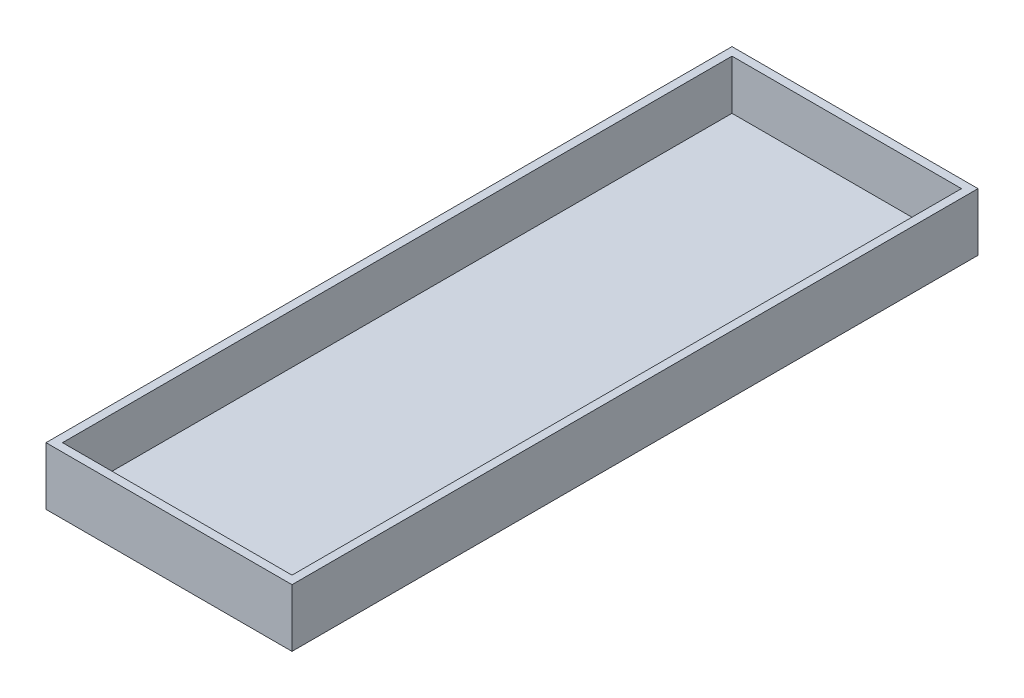
ISO-10303-21;
HEADER;
FILE_DESCRIPTION(('STEP AP214'),'2;1');
FILE_NAME('part.step','',(''),(''),'','','');
FILE_SCHEMA(('AUTOMOTIVE_DESIGN { 1 0 10303 214 1 1 1 1 }'));
ENDSEC;
DATA;
#1=APPLICATION_CONTEXT('core data for automotive mechanical design processes');
#2=APPLICATION_PROTOCOL_DEFINITION('international standard','automotive_design',2000,#1);
#3=PRODUCT_CONTEXT('',#1,'mechanical');
#4=PRODUCT('Part','Part','',(#3));
#5=PRODUCT_RELATED_PRODUCT_CATEGORY('part','',(#4));
#6=PRODUCT_DEFINITION_FORMATION('','',#4);
#7=PRODUCT_DEFINITION_CONTEXT('part definition',#1,'design');
#8=PRODUCT_DEFINITION('design','',#6,#7);
#9=PRODUCT_DEFINITION_SHAPE('','',#8);
#10=(LENGTH_UNIT() NAMED_UNIT(*) SI_UNIT(.MILLI.,.METRE.));
#11=(NAMED_UNIT(*) PLANE_ANGLE_UNIT() SI_UNIT($,.RADIAN.));
#12=(NAMED_UNIT(*) SI_UNIT($,.STERADIAN.) SOLID_ANGLE_UNIT());
#13=UNCERTAINTY_MEASURE_WITH_UNIT(LENGTH_MEASURE(1.E-05),#10,'distance_accuracy_value','');
#14=(GEOMETRIC_REPRESENTATION_CONTEXT(3) GLOBAL_UNCERTAINTY_ASSIGNED_CONTEXT((#13)) GLOBAL_UNIT_ASSIGNED_CONTEXT((#10,
#11,#12)) REPRESENTATION_CONTEXT('',''));
#15=CARTESIAN_POINT('',(0.,0.,0.));
#16=DIRECTION('',(0.,0.,1.));
#17=DIRECTION('',(1.,0.,0.));
#18=AXIS2_PLACEMENT_3D('',#15,#16,#17);
#19=CARTESIAN_POINT('',(-137.816055238894,35.2102765426575,166.2));
#20=DIRECTION('',(1.,0.,0.));
#21=DIRECTION('',(0.,0.,-1.));
#22=AXIS2_PLACEMENT_3D('',#19,#20,#21);
#23=PLANE('',#22);
#24=DIRECTION('',(0.,-1.,0.));
#25=VECTOR('',#24,1.);
#26=CARTESIAN_POINT('',(-137.816055238894,35.2102765426575,0.));
#27=LINE('',#26,#25);
#28=CARTESIAN_POINT('',(-137.816055238894,35.2102765426575,0.));
#29=VERTEX_POINT('',#28);
#30=CARTESIAN_POINT('',(-137.816055238894,21.2102765426575,0.));
#31=VERTEX_POINT('',#30);
#32=EDGE_CURVE('E147',#29,#31,#27,.T.);
#33=ORIENTED_EDGE('',*,*,#32,.T.);
#34=DIRECTION('',(0.,0.,-1.));
#35=VECTOR('',#34,1.);
#36=CARTESIAN_POINT('',(-137.816055238894,21.2102765426575,166.2));
#37=LINE('',#36,#35);
#38=CARTESIAN_POINT('',(-137.816055238894,21.2102765426575,166.2));
#39=VERTEX_POINT('',#38);
#40=EDGE_CURVE('E11',#39,#31,#37,.T.);
#41=ORIENTED_EDGE('',*,*,#40,.F.);
#42=DIRECTION('',(0.,-1.,0.));
#43=VECTOR('',#42,1.);
#44=CARTESIAN_POINT('',(-137.816055238894,35.2102765426575,166.2));
#45=LINE('',#44,#43);
#46=CARTESIAN_POINT('',(-137.816055238894,35.2102765426575,166.2));
#47=VERTEX_POINT('',#46);
#48=EDGE_CURVE('E151',#47,#39,#45,.T.);
#49=ORIENTED_EDGE('',*,*,#48,.F.);
#50=DIRECTION('',(0.,0.,-1.));
#51=VECTOR('',#50,1.);
#52=CARTESIAN_POINT('',(-137.816055238894,35.2102765426575,166.2));
#53=LINE('',#52,#51);
#54=EDGE_CURVE('E157',#47,#29,#53,.T.);
#55=ORIENTED_EDGE('',*,*,#54,.T.);
#56=EDGE_LOOP('',(#33,#41,#49,#55));
#57=FACE_BOUND('',#56,.T.);
#58=ADVANCED_FACE('F39',(#57),#23,.F.);
#59=CARTESIAN_POINT('',(-137.816055238894,21.2102765426575,166.2));
#60=DIRECTION('',(0.,1.,0.));
#61=DIRECTION('',(0.,0.,1.));
#62=AXIS2_PLACEMENT_3D('',#59,#60,#61);
#63=PLANE('',#62);
#64=DIRECTION('',(1.,0.,0.));
#65=VECTOR('',#64,1.);
#66=CARTESIAN_POINT('',(-137.816055238894,21.2102765426575,0.));
#67=LINE('',#66,#65);
#68=CARTESIAN_POINT('',(-78.2160552388939,21.2102765426575,0.));
#69=VERTEX_POINT('',#68);
#70=EDGE_CURVE('E160',#31,#69,#67,.T.);
#71=ORIENTED_EDGE('',*,*,#70,.T.);
#72=DIRECTION('',(0.,0.,-1.));
#73=VECTOR('',#72,1.);
#74=CARTESIAN_POINT('',(-78.2160552388939,21.2102765426575,166.2));
#75=LINE('',#74,#73);
#76=CARTESIAN_POINT('',(-78.2160552388939,21.2102765426575,166.2));
#77=VERTEX_POINT('',#76);
#78=EDGE_CURVE('E46',#77,#69,#75,.T.);
#79=ORIENTED_EDGE('',*,*,#78,.F.);
#80=DIRECTION('',(1.,0.,0.));
#81=VECTOR('',#80,1.);
#82=CARTESIAN_POINT('',(-137.816055238894,21.2102765426575,166.2));
#83=LINE('',#82,#81);
#84=EDGE_CURVE('E90',#39,#77,#83,.T.);
#85=ORIENTED_EDGE('',*,*,#84,.F.);
#86=ORIENTED_EDGE('',*,*,#40,.T.);
#87=EDGE_LOOP('',(#71,#79,#85,#86));
#88=FACE_BOUND('',#87,.T.);
#89=ADVANCED_FACE('F191',(#88),#63,.F.);
#90=CARTESIAN_POINT('',(-78.2160552388939,35.2102765426575,166.2));
#91=DIRECTION('',(-1.,0.,0.));
#92=DIRECTION('',(0.,0.,1.));
#93=AXIS2_PLACEMENT_3D('',#90,#91,#92);
#94=PLANE('',#93);
#95=DIRECTION('',(0.,1.,0.));
#96=VECTOR('',#95,1.);
#97=CARTESIAN_POINT('',(-78.2160552388939,35.2102765426575,0.));
#98=LINE('',#97,#96);
#99=CARTESIAN_POINT('',(-78.2160552388939,35.2102765426575,0.));
#100=VERTEX_POINT('',#99);
#101=EDGE_CURVE('E162',#69,#100,#98,.T.);
#102=ORIENTED_EDGE('',*,*,#101,.T.);
#103=DIRECTION('',(0.,0.,-1.));
#104=VECTOR('',#103,1.);
#105=CARTESIAN_POINT('',(-78.2160552388939,35.2102765426575,166.2));
#106=LINE('',#105,#104);
#107=CARTESIAN_POINT('',(-78.2160552388939,35.2102765426575,166.2));
#108=VERTEX_POINT('',#107);
#109=EDGE_CURVE('E166',#108,#100,#106,.T.);
#110=ORIENTED_EDGE('',*,*,#109,.F.);
#111=DIRECTION('',(0.,1.,0.));
#112=VECTOR('',#111,1.);
#113=CARTESIAN_POINT('',(-78.2160552388939,35.2102765426575,166.2));
#114=LINE('',#113,#112);
#115=EDGE_CURVE('E154',#77,#108,#114,.T.);
#116=ORIENTED_EDGE('',*,*,#115,.F.);
#117=ORIENTED_EDGE('',*,*,#78,.T.);
#118=EDGE_LOOP('',(#102,#110,#116,#117));
#119=FACE_BOUND('',#118,.T.);
#120=ADVANCED_FACE('F171',(#119),#94,.F.);
#121=CARTESIAN_POINT('',(-137.816055238894,35.2102765426575,166.2));
#122=DIRECTION('',(0.,-1.,0.));
#123=DIRECTION('',(0.,0.,-1.));
#124=AXIS2_PLACEMENT_3D('',#121,#122,#123);
#125=PLANE('',#124);
#126=DIRECTION('',(0.,0.,1.));
#127=VECTOR('',#126,1.);
#128=CARTESIAN_POINT('',(-80.2160552388939,35.2102765426575,2.));
#129=LINE('',#128,#127);
#130=CARTESIAN_POINT('',(-80.2160552388939,35.2102765426575,2.));
#131=VERTEX_POINT('',#130);
#132=CARTESIAN_POINT('',(-80.2160552388939,35.2102765426575,164.2));
#133=VERTEX_POINT('',#132);
#134=EDGE_CURVE('E141',#131,#133,#129,.T.);
#135=ORIENTED_EDGE('',*,*,#134,.T.);
#136=DIRECTION('',(1.,0.,0.));
#137=VECTOR('',#136,1.);
#138=CARTESIAN_POINT('',(-135.816055238894,35.2102765426575,164.2));
#139=LINE('',#138,#137);
#140=CARTESIAN_POINT('',(-135.816055238894,35.2102765426575,164.2));
#141=VERTEX_POINT('',#140);
#142=EDGE_CURVE('E53',#141,#133,#139,.T.);
#143=ORIENTED_EDGE('',*,*,#142,.F.);
#144=DIRECTION('',(0.,0.,1.));
#145=VECTOR('',#144,1.);
#146=CARTESIAN_POINT('',(-135.816055238894,35.2102765426575,2.));
#147=LINE('',#146,#145);
#148=CARTESIAN_POINT('',(-135.816055238894,35.2102765426575,2.));
#149=VERTEX_POINT('',#148);
#150=EDGE_CURVE('E132',#149,#141,#147,.T.);
#151=ORIENTED_EDGE('',*,*,#150,.F.);
#152=DIRECTION('',(1.,0.,0.));
#153=VECTOR('',#152,1.);
#154=CARTESIAN_POINT('',(-135.816055238894,35.2102765426575,2.));
#155=LINE('',#154,#153);
#156=EDGE_CURVE('E135',#149,#131,#155,.T.);
#157=ORIENTED_EDGE('',*,*,#156,.T.);
#158=EDGE_LOOP('',(#135,#143,#151,#157));
#159=FACE_BOUND('',#158,.T.);
#160=DIRECTION('',(-1.,0.,0.));
#161=VECTOR('',#160,1.);
#162=CARTESIAN_POINT('',(-137.816055238894,35.2102765426575,0.));
#163=LINE('',#162,#161);
#164=EDGE_CURVE('E83',#100,#29,#163,.T.);
#165=ORIENTED_EDGE('',*,*,#164,.T.);
#166=ORIENTED_EDGE('',*,*,#54,.F.);
#167=DIRECTION('',(-1.,0.,0.));
#168=VECTOR('',#167,1.);
#169=CARTESIAN_POINT('',(-137.816055238894,35.2102765426575,166.2));
#170=LINE('',#169,#168);
#171=EDGE_CURVE('E62',#108,#47,#170,.T.);
#172=ORIENTED_EDGE('',*,*,#171,.F.);
#173=ORIENTED_EDGE('',*,*,#109,.T.);
#174=EDGE_LOOP('',(#165,#166,#172,#173));
#175=FACE_BOUND('',#174,.T.);
#176=ADVANCED_FACE('F179',(#159,#175),#125,.F.);
#177=CARTESIAN_POINT('',(0.,0.,166.2));
#178=DIRECTION('',(0.,0.,1.));
#179=DIRECTION('',(1.,0.,0.));
#180=AXIS2_PLACEMENT_3D('',#177,#178,#179);
#181=PLANE('',#180);
#182=ORIENTED_EDGE('',*,*,#48,.T.);
#183=ORIENTED_EDGE('',*,*,#84,.T.);
#184=ORIENTED_EDGE('',*,*,#115,.T.);
#185=ORIENTED_EDGE('',*,*,#171,.T.);
#186=EDGE_LOOP('',(#182,#183,#184,#185));
#187=FACE_BOUND('',#186,.T.);
#188=ADVANCED_FACE('F181',(#187),#181,.T.);
#189=CARTESIAN_POINT('',(0.,0.,0.));
#190=DIRECTION('',(0.,0.,1.));
#191=DIRECTION('',(1.,0.,0.));
#192=AXIS2_PLACEMENT_3D('',#189,#190,#191);
#193=PLANE('',#192);
#194=ORIENTED_EDGE('',*,*,#32,.F.);
#195=ORIENTED_EDGE('',*,*,#164,.F.);
#196=ORIENTED_EDGE('',*,*,#101,.F.);
#197=ORIENTED_EDGE('',*,*,#70,.F.);
#198=EDGE_LOOP('',(#194,#195,#196,#197));
#199=FACE_BOUND('',#198,.T.);
#200=ADVANCED_FACE('F175',(#199),#193,.F.);
#201=CARTESIAN_POINT('',(-135.816055238894,23.2102765426575,164.2));
#202=DIRECTION('',(0.,0.,1.));
#203=DIRECTION('',(1.,0.,0.));
#204=AXIS2_PLACEMENT_3D('',#201,#202,#203);
#205=PLANE('',#204);
#206=ORIENTED_EDGE('',*,*,#142,.T.);
#207=DIRECTION('',(0.,1.,0.));
#208=VECTOR('',#207,1.);
#209=CARTESIAN_POINT('',(-80.2160552388939,23.2102765426575,164.2));
#210=LINE('',#209,#208);
#211=CARTESIAN_POINT('',(-80.2160552388939,23.2102765426575,164.2));
#212=VERTEX_POINT('',#211);
#213=EDGE_CURVE('E116',#212,#133,#210,.T.);
#214=ORIENTED_EDGE('',*,*,#213,.F.);
#215=DIRECTION('',(1.,0.,0.));
#216=VECTOR('',#215,1.);
#217=CARTESIAN_POINT('',(-135.816055238894,23.2102765426575,164.2));
#218=LINE('',#217,#216);
#219=CARTESIAN_POINT('',(-135.816055238894,23.2102765426575,164.2));
#220=VERTEX_POINT('',#219);
#221=EDGE_CURVE('E123',#220,#212,#218,.T.);
#222=ORIENTED_EDGE('',*,*,#221,.F.);
#223=DIRECTION('',(0.,1.,0.));
#224=VECTOR('',#223,1.);
#225=CARTESIAN_POINT('',(-135.816055238894,23.2102765426575,164.2));
#226=LINE('',#225,#224);
#227=EDGE_CURVE('E145',#220,#141,#226,.T.);
#228=ORIENTED_EDGE('',*,*,#227,.T.);
#229=EDGE_LOOP('',(#206,#214,#222,#228));
#230=FACE_BOUND('',#229,.T.);
#231=ADVANCED_FACE('F126',(#230),#205,.F.);
#232=CARTESIAN_POINT('',(-135.816055238894,23.2102765426575,2.));
#233=DIRECTION('',(-1.,0.,0.));
#234=DIRECTION('',(0.,0.,1.));
#235=AXIS2_PLACEMENT_3D('',#232,#233,#234);
#236=PLANE('',#235);
#237=ORIENTED_EDGE('',*,*,#150,.T.);
#238=ORIENTED_EDGE('',*,*,#227,.F.);
#239=DIRECTION('',(0.,0.,1.));
#240=VECTOR('',#239,1.);
#241=CARTESIAN_POINT('',(-135.816055238894,23.2102765426575,2.));
#242=LINE('',#241,#240);
#243=CARTESIAN_POINT('',(-135.816055238894,23.2102765426575,2.));
#244=VERTEX_POINT('',#243);
#245=EDGE_CURVE('E128',#244,#220,#242,.T.);
#246=ORIENTED_EDGE('',*,*,#245,.F.);
#247=DIRECTION('',(0.,1.,0.));
#248=VECTOR('',#247,1.);
#249=CARTESIAN_POINT('',(-135.816055238894,23.2102765426575,2.));
#250=LINE('',#249,#248);
#251=EDGE_CURVE('E148',#244,#149,#250,.T.);
#252=ORIENTED_EDGE('',*,*,#251,.T.);
#253=EDGE_LOOP('',(#237,#238,#246,#252));
#254=FACE_BOUND('',#253,.T.);
#255=ADVANCED_FACE('F224',(#254),#236,.F.);
#256=CARTESIAN_POINT('',(-135.816055238894,23.2102765426575,2.));
#257=DIRECTION('',(0.,0.,1.));
#258=DIRECTION('',(1.,0.,0.));
#259=AXIS2_PLACEMENT_3D('',#256,#257,#258);
#260=PLANE('',#259);
#261=ORIENTED_EDGE('',*,*,#156,.F.);
#262=ORIENTED_EDGE('',*,*,#251,.F.);
#263=DIRECTION('',(1.,0.,0.));
#264=VECTOR('',#263,1.);
#265=CARTESIAN_POINT('',(-135.816055238894,23.2102765426575,2.));
#266=LINE('',#265,#264);
#267=CARTESIAN_POINT('',(-80.2160552388939,23.2102765426575,2.));
#268=VERTEX_POINT('',#267);
#269=EDGE_CURVE('E122',#244,#268,#266,.T.);
#270=ORIENTED_EDGE('',*,*,#269,.T.);
#271=DIRECTION('',(0.,1.,0.));
#272=VECTOR('',#271,1.);
#273=CARTESIAN_POINT('',(-80.2160552388939,23.2102765426575,2.));
#274=LINE('',#273,#272);
#275=EDGE_CURVE('E118',#268,#131,#274,.T.);
#276=ORIENTED_EDGE('',*,*,#275,.T.);
#277=EDGE_LOOP('',(#261,#262,#270,#276));
#278=FACE_BOUND('',#277,.T.);
#279=ADVANCED_FACE('F233',(#278),#260,.T.);
#280=CARTESIAN_POINT('',(-80.2160552388939,23.2102765426575,2.));
#281=DIRECTION('',(-1.,0.,0.));
#282=DIRECTION('',(0.,0.,1.));
#283=AXIS2_PLACEMENT_3D('',#280,#281,#282);
#284=PLANE('',#283);
#285=ORIENTED_EDGE('',*,*,#134,.F.);
#286=ORIENTED_EDGE('',*,*,#275,.F.);
#287=DIRECTION('',(0.,0.,1.));
#288=VECTOR('',#287,1.);
#289=CARTESIAN_POINT('',(-80.2160552388939,23.2102765426575,2.));
#290=LINE('',#289,#288);
#291=EDGE_CURVE('E113',#268,#212,#290,.T.);
#292=ORIENTED_EDGE('',*,*,#291,.T.);
#293=ORIENTED_EDGE('',*,*,#213,.T.);
#294=EDGE_LOOP('',(#285,#286,#292,#293));
#295=FACE_BOUND('',#294,.T.);
#296=ADVANCED_FACE('F115',(#295),#284,.T.);
#297=CARTESIAN_POINT('',(0.,23.2102765426575,0.));
#298=DIRECTION('',(0.,-1.,0.));
#299=DIRECTION('',(0.,0.,-1.));
#300=AXIS2_PLACEMENT_3D('',#297,#298,#299);
#301=PLANE('',#300);
#302=ORIENTED_EDGE('',*,*,#221,.T.);
#303=ORIENTED_EDGE('',*,*,#291,.F.);
#304=ORIENTED_EDGE('',*,*,#269,.F.);
#305=ORIENTED_EDGE('',*,*,#245,.T.);
#306=EDGE_LOOP('',(#302,#303,#304,#305));
#307=FACE_BOUND('',#306,.T.);
#308=ADVANCED_FACE('F130',(#307),#301,.F.);
#309=CLOSED_SHELL('',(#58,#89,#120,#176,#188,#200,#231,#255,#279,#296,#308));
#310=MANIFOLD_SOLID_BREP('B2',#309);
#311=ADVANCED_BREP_SHAPE_REPRESENTATION('',(#18,#310),#14);
#312=SHAPE_DEFINITION_REPRESENTATION(#9,#311);
ENDSEC;
END-ISO-10303-21;
